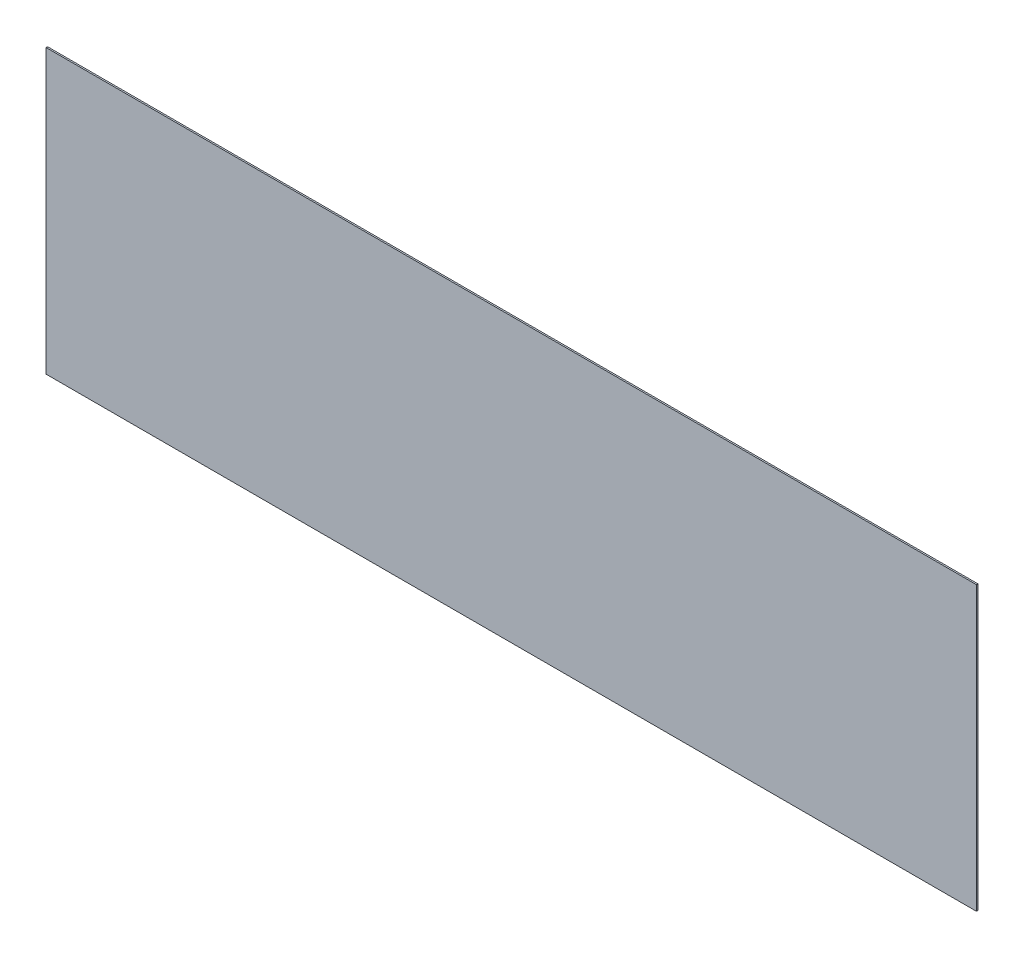
ISO-10303-21;
HEADER;
FILE_DESCRIPTION(('STEP AP214'),'2;1');
FILE_NAME('part.step','',(''),(''),'','','');
FILE_SCHEMA(('AUTOMOTIVE_DESIGN { 1 0 10303 214 1 1 1 1 }'));
ENDSEC;
DATA;
#1=APPLICATION_CONTEXT('core data for automotive mechanical design processes');
#2=APPLICATION_PROTOCOL_DEFINITION('international standard','automotive_design',2000,#1);
#3=PRODUCT_CONTEXT('',#1,'mechanical');
#4=PRODUCT('Part','Part','',(#3));
#5=PRODUCT_RELATED_PRODUCT_CATEGORY('part','',(#4));
#6=PRODUCT_DEFINITION_FORMATION('','',#4);
#7=PRODUCT_DEFINITION_CONTEXT('part definition',#1,'design');
#8=PRODUCT_DEFINITION('design','',#6,#7);
#9=PRODUCT_DEFINITION_SHAPE('','',#8);
#10=(LENGTH_UNIT() NAMED_UNIT(*) SI_UNIT(.MILLI.,.METRE.));
#11=(NAMED_UNIT(*) PLANE_ANGLE_UNIT() SI_UNIT($,.RADIAN.));
#12=(NAMED_UNIT(*) SI_UNIT($,.STERADIAN.) SOLID_ANGLE_UNIT());
#13=UNCERTAINTY_MEASURE_WITH_UNIT(LENGTH_MEASURE(1.E-05),#10,'distance_accuracy_value','');
#14=(GEOMETRIC_REPRESENTATION_CONTEXT(3) GLOBAL_UNCERTAINTY_ASSIGNED_CONTEXT((#13)) GLOBAL_UNIT_ASSIGNED_CONTEXT((#10,
#11,#12)) REPRESENTATION_CONTEXT('',''));
#15=CARTESIAN_POINT('',(0.,0.,0.));
#16=DIRECTION('',(0.,0.,1.));
#17=DIRECTION('',(1.,0.,0.));
#18=AXIS2_PLACEMENT_3D('',#15,#16,#17);
#19=CARTESIAN_POINT('',(-1250.,380.,4.));
#20=DIRECTION('',(1.,0.,0.));
#21=DIRECTION('',(0.,0.,-1.));
#22=AXIS2_PLACEMENT_3D('',#19,#20,#21);
#23=PLANE('',#22);
#24=DIRECTION('',(0.,-1.,0.));
#25=VECTOR('',#24,1.);
#26=CARTESIAN_POINT('',(-1250.,380.,0.));
#27=LINE('',#26,#25);
#28=CARTESIAN_POINT('',(-1250.,380.,0.));
#29=VERTEX_POINT('',#28);
#30=CARTESIAN_POINT('',(-1250.,-380.,0.));
#31=VERTEX_POINT('',#30);
#32=EDGE_CURVE('E95',#29,#31,#27,.T.);
#33=ORIENTED_EDGE('',*,*,#32,.T.);
#34=DIRECTION('',(0.,0.,-1.));
#35=VECTOR('',#34,1.);
#36=CARTESIAN_POINT('',(-1250.,-380.,4.));
#37=LINE('',#36,#35);
#38=CARTESIAN_POINT('',(-1250.,-380.,4.));
#39=VERTEX_POINT('',#38);
#40=EDGE_CURVE('E11',#39,#31,#37,.T.);
#41=ORIENTED_EDGE('',*,*,#40,.F.);
#42=DIRECTION('',(0.,-1.,0.));
#43=VECTOR('',#42,1.);
#44=CARTESIAN_POINT('',(-1250.,380.,4.));
#45=LINE('',#44,#43);
#46=CARTESIAN_POINT('',(-1250.,380.,4.));
#47=VERTEX_POINT('',#46);
#48=EDGE_CURVE('E83',#47,#39,#45,.T.);
#49=ORIENTED_EDGE('',*,*,#48,.F.);
#50=DIRECTION('',(0.,0.,-1.));
#51=VECTOR('',#50,1.);
#52=CARTESIAN_POINT('',(-1250.,380.,4.));
#53=LINE('',#52,#51);
#54=EDGE_CURVE('E91',#47,#29,#53,.T.);
#55=ORIENTED_EDGE('',*,*,#54,.T.);
#56=EDGE_LOOP('',(#33,#41,#49,#55));
#57=FACE_BOUND('',#56,.T.);
#58=ADVANCED_FACE('F32',(#57),#23,.F.);
#59=CARTESIAN_POINT('',(-1250.,-380.,4.));
#60=DIRECTION('',(0.,1.,0.));
#61=DIRECTION('',(-1.,0.,0.));
#62=AXIS2_PLACEMENT_3D('',#59,#60,#61);
#63=PLANE('',#62);
#64=DIRECTION('',(1.,0.,0.));
#65=VECTOR('',#64,1.);
#66=CARTESIAN_POINT('',(-1250.,-380.,0.));
#67=LINE('',#66,#65);
#68=CARTESIAN_POINT('',(1250.,-380.,0.));
#69=VERTEX_POINT('',#68);
#70=EDGE_CURVE('E87',#31,#69,#67,.T.);
#71=ORIENTED_EDGE('',*,*,#70,.T.);
#72=DIRECTION('',(0.,0.,-1.));
#73=VECTOR('',#72,1.);
#74=CARTESIAN_POINT('',(1250.,-380.,4.));
#75=LINE('',#74,#73);
#76=CARTESIAN_POINT('',(1250.,-380.,4.));
#77=VERTEX_POINT('',#76);
#78=EDGE_CURVE('E40',#77,#69,#75,.T.);
#79=ORIENTED_EDGE('',*,*,#78,.F.);
#80=DIRECTION('',(1.,0.,0.));
#81=VECTOR('',#80,1.);
#82=CARTESIAN_POINT('',(-1250.,-380.,4.));
#83=LINE('',#82,#81);
#84=EDGE_CURVE('E78',#39,#77,#83,.T.);
#85=ORIENTED_EDGE('',*,*,#84,.F.);
#86=ORIENTED_EDGE('',*,*,#40,.T.);
#87=EDGE_LOOP('',(#71,#79,#85,#86));
#88=FACE_BOUND('',#87,.T.);
#89=ADVANCED_FACE('F86',(#88),#63,.F.);
#90=CARTESIAN_POINT('',(1250.,380.,4.));
#91=DIRECTION('',(-1.,0.,0.));
#92=DIRECTION('',(0.,0.,1.));
#93=AXIS2_PLACEMENT_3D('',#90,#91,#92);
#94=PLANE('',#93);
#95=DIRECTION('',(0.,1.,0.));
#96=VECTOR('',#95,1.);
#97=CARTESIAN_POINT('',(1250.,380.,0.));
#98=LINE('',#97,#96);
#99=CARTESIAN_POINT('',(1250.,380.,0.));
#100=VERTEX_POINT('',#99);
#101=EDGE_CURVE('E65',#69,#100,#98,.T.);
#102=ORIENTED_EDGE('',*,*,#101,.T.);
#103=DIRECTION('',(0.,0.,-1.));
#104=VECTOR('',#103,1.);
#105=CARTESIAN_POINT('',(1250.,380.,4.));
#106=LINE('',#105,#104);
#107=CARTESIAN_POINT('',(1250.,380.,4.));
#108=VERTEX_POINT('',#107);
#109=EDGE_CURVE('E88',#108,#100,#106,.T.);
#110=ORIENTED_EDGE('',*,*,#109,.F.);
#111=DIRECTION('',(0.,1.,0.));
#112=VECTOR('',#111,1.);
#113=CARTESIAN_POINT('',(1250.,380.,4.));
#114=LINE('',#113,#112);
#115=EDGE_CURVE('E81',#77,#108,#114,.T.);
#116=ORIENTED_EDGE('',*,*,#115,.F.);
#117=ORIENTED_EDGE('',*,*,#78,.T.);
#118=EDGE_LOOP('',(#102,#110,#116,#117));
#119=FACE_BOUND('',#118,.T.);
#120=ADVANCED_FACE('F89',(#119),#94,.F.);
#121=CARTESIAN_POINT('',(-1250.,380.,4.));
#122=DIRECTION('',(0.,-1.,0.));
#123=DIRECTION('',(1.,0.,0.));
#124=AXIS2_PLACEMENT_3D('',#121,#122,#123);
#125=PLANE('',#124);
#126=DIRECTION('',(-1.,0.,0.));
#127=VECTOR('',#126,1.);
#128=CARTESIAN_POINT('',(-1250.,380.,0.));
#129=LINE('',#128,#127);
#130=EDGE_CURVE('E71',#100,#29,#129,.T.);
#131=ORIENTED_EDGE('',*,*,#130,.T.);
#132=ORIENTED_EDGE('',*,*,#54,.F.);
#133=DIRECTION('',(-1.,0.,0.));
#134=VECTOR('',#133,1.);
#135=CARTESIAN_POINT('',(-1250.,380.,4.));
#136=LINE('',#135,#134);
#137=EDGE_CURVE('E48',#108,#47,#136,.T.);
#138=ORIENTED_EDGE('',*,*,#137,.F.);
#139=ORIENTED_EDGE('',*,*,#109,.T.);
#140=EDGE_LOOP('',(#131,#132,#138,#139));
#141=FACE_BOUND('',#140,.T.);
#142=ADVANCED_FACE('F102',(#141),#125,.F.);
#143=CARTESIAN_POINT('',(0.,0.,4.));
#144=DIRECTION('',(0.,0.,1.));
#145=DIRECTION('',(1.,0.,0.));
#146=AXIS2_PLACEMENT_3D('',#143,#144,#145);
#147=PLANE('',#146);
#148=ORIENTED_EDGE('',*,*,#48,.T.);
#149=ORIENTED_EDGE('',*,*,#84,.T.);
#150=ORIENTED_EDGE('',*,*,#115,.T.);
#151=ORIENTED_EDGE('',*,*,#137,.T.);
#152=EDGE_LOOP('',(#148,#149,#150,#151));
#153=FACE_BOUND('',#152,.T.);
#154=ADVANCED_FACE('F79',(#153),#147,.T.);
#155=CARTESIAN_POINT('',(0.,0.,0.));
#156=DIRECTION('',(0.,0.,1.));
#157=DIRECTION('',(1.,0.,0.));
#158=AXIS2_PLACEMENT_3D('',#155,#156,#157);
#159=PLANE('',#158);
#160=ORIENTED_EDGE('',*,*,#32,.F.);
#161=ORIENTED_EDGE('',*,*,#130,.F.);
#162=ORIENTED_EDGE('',*,*,#101,.F.);
#163=ORIENTED_EDGE('',*,*,#70,.F.);
#164=EDGE_LOOP('',(#160,#161,#162,#163));
#165=FACE_BOUND('',#164,.T.);
#166=ADVANCED_FACE('F105',(#165),#159,.F.);
#167=CLOSED_SHELL('',(#58,#89,#120,#142,#154,#166));
#168=MANIFOLD_SOLID_BREP('B2',#167);
#169=ADVANCED_BREP_SHAPE_REPRESENTATION('',(#18,#168),#14);
#170=SHAPE_DEFINITION_REPRESENTATION(#9,#169);
ENDSEC;
END-ISO-10303-21;
